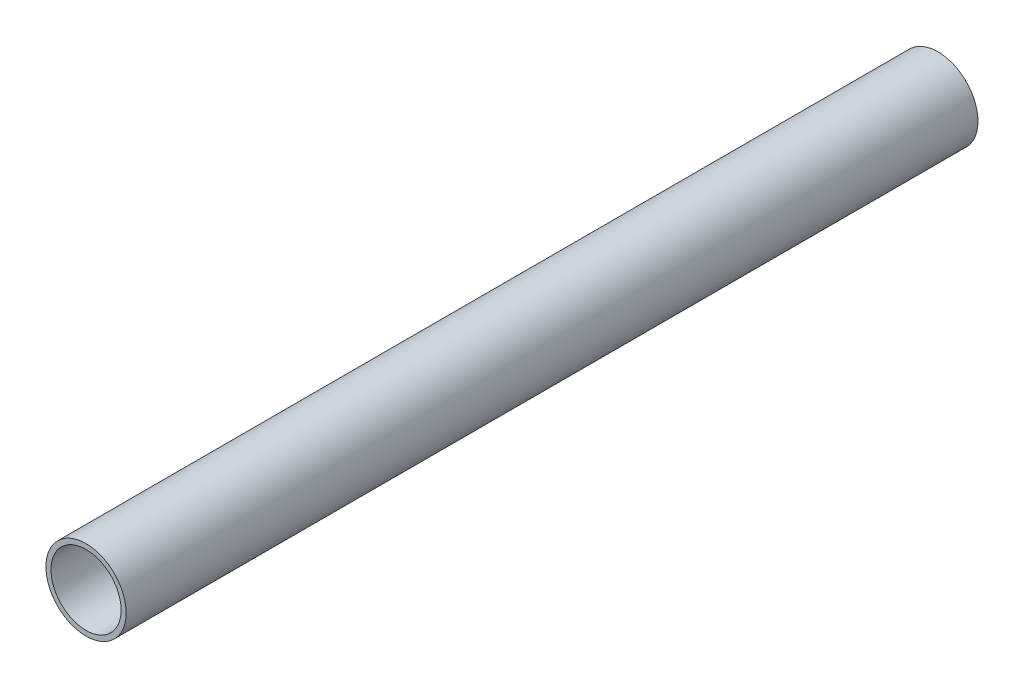
ISO-10303-21;
HEADER;
FILE_DESCRIPTION(('STEP AP214'),'2;1');
FILE_NAME('part.step','',(''),(''),'','','');
FILE_SCHEMA(('AUTOMOTIVE_DESIGN { 1 0 10303 214 1 1 1 1 }'));
ENDSEC;
DATA;
#1=APPLICATION_CONTEXT('core data for automotive mechanical design processes');
#2=APPLICATION_PROTOCOL_DEFINITION('international standard','automotive_design',2000,#1);
#3=PRODUCT_CONTEXT('',#1,'mechanical');
#4=PRODUCT('Part','Part','',(#3));
#5=PRODUCT_RELATED_PRODUCT_CATEGORY('part','',(#4));
#6=PRODUCT_DEFINITION_FORMATION('','',#4);
#7=PRODUCT_DEFINITION_CONTEXT('part definition',#1,'design');
#8=PRODUCT_DEFINITION('design','',#6,#7);
#9=PRODUCT_DEFINITION_SHAPE('','',#8);
#10=(LENGTH_UNIT() NAMED_UNIT(*) SI_UNIT(.MILLI.,.METRE.));
#11=(NAMED_UNIT(*) PLANE_ANGLE_UNIT() SI_UNIT($,.RADIAN.));
#12=(NAMED_UNIT(*) SI_UNIT($,.STERADIAN.) SOLID_ANGLE_UNIT());
#13=UNCERTAINTY_MEASURE_WITH_UNIT(LENGTH_MEASURE(1.E-05),#10,'distance_accuracy_value','');
#14=(GEOMETRIC_REPRESENTATION_CONTEXT(3) GLOBAL_UNCERTAINTY_ASSIGNED_CONTEXT((#13)) GLOBAL_UNIT_ASSIGNED_CONTEXT((#10,
#11,#12)) REPRESENTATION_CONTEXT('',''));
#15=CARTESIAN_POINT('',(0.,0.,0.));
#16=DIRECTION('',(0.,0.,1.));
#17=DIRECTION('',(1.,0.,0.));
#18=AXIS2_PLACEMENT_3D('',#15,#16,#17);
#19=CARTESIAN_POINT('',(0.,0.,269.89405));
#20=DIRECTION('',(0.,0.,1.));
#21=DIRECTION('',(1.,0.,0.));
#22=AXIS2_PLACEMENT_3D('',#19,#20,#21);
#23=PLANE('',#22);
#24=CARTESIAN_POINT('',(0.,0.,269.89405));
#25=DIRECTION('',(0.,0.,1.));
#26=DIRECTION('',(1.,0.,0.));
#27=AXIS2_PLACEMENT_3D('',#24,#25,#26);
#28=CIRCLE('',#27,25.4);
#29=CARTESIAN_POINT('',(25.4,0.,269.89405));
#30=VERTEX_POINT('',#29);
#31=EDGE_CURVE('E10',#30,#30,#28,.T.);
#32=ORIENTED_EDGE('',*,*,#31,.T.);
#33=EDGE_LOOP('',(#32));
#34=FACE_BOUND('',#33,.T.);
#35=CARTESIAN_POINT('',(0.,0.,269.89405));
#36=DIRECTION('',(0.,0.,1.));
#37=DIRECTION('',(1.,0.,0.));
#38=AXIS2_PLACEMENT_3D('',#35,#36,#37);
#39=CIRCLE('',#38,22.225);
#40=CARTESIAN_POINT('',(22.225,0.,269.89405));
#41=VERTEX_POINT('',#40);
#42=EDGE_CURVE('E54',#41,#41,#39,.T.);
#43=ORIENTED_EDGE('',*,*,#42,.F.);
#44=EDGE_LOOP('',(#43));
#45=FACE_BOUND('',#44,.T.);
#46=ADVANCED_FACE('F41',(#34,#45),#23,.T.);
#47=CARTESIAN_POINT('',(0.,0.,-269.89405));
#48=DIRECTION('',(0.,0.,1.));
#49=DIRECTION('',(1.,0.,0.));
#50=AXIS2_PLACEMENT_3D('',#47,#48,#49);
#51=PLANE('',#50);
#52=CARTESIAN_POINT('',(0.,0.,-269.89405));
#53=DIRECTION('',(0.,0.,1.));
#54=DIRECTION('',(1.,0.,0.));
#55=AXIS2_PLACEMENT_3D('',#52,#53,#54);
#56=CIRCLE('',#55,25.4);
#57=CARTESIAN_POINT('',(25.4,0.,-269.89405));
#58=VERTEX_POINT('',#57);
#59=EDGE_CURVE('E45',#58,#58,#56,.T.);
#60=ORIENTED_EDGE('',*,*,#59,.F.);
#61=EDGE_LOOP('',(#60));
#62=FACE_BOUND('',#61,.T.);
#63=CARTESIAN_POINT('',(0.,0.,-269.89405));
#64=DIRECTION('',(0.,0.,1.));
#65=DIRECTION('',(1.,0.,0.));
#66=AXIS2_PLACEMENT_3D('',#63,#64,#65);
#67=CIRCLE('',#66,22.225);
#68=CARTESIAN_POINT('',(22.225,0.,-269.89405));
#69=VERTEX_POINT('',#68);
#70=EDGE_CURVE('E56',#69,#69,#67,.T.);
#71=ORIENTED_EDGE('',*,*,#70,.T.);
#72=EDGE_LOOP('',(#71));
#73=FACE_BOUND('',#72,.T.);
#74=ADVANCED_FACE('F68',(#62,#73),#51,.F.);
#75=CARTESIAN_POINT('',(0.,0.,269.89405));
#76=DIRECTION('',(0.,0.,-1.));
#77=DIRECTION('',(-1.,0.,0.));
#78=AXIS2_PLACEMENT_3D('',#75,#76,#77);
#79=CYLINDRICAL_SURFACE('',#78,25.4);
#80=ORIENTED_EDGE('',*,*,#31,.F.);
#81=EDGE_LOOP('',(#80));
#82=FACE_BOUND('',#81,.T.);
#83=ORIENTED_EDGE('',*,*,#59,.T.);
#84=EDGE_LOOP('',(#83));
#85=FACE_BOUND('',#84,.T.);
#86=ADVANCED_FACE('F43',(#82,#85),#79,.T.);
#87=CARTESIAN_POINT('',(0.,0.,269.89405));
#88=DIRECTION('',(0.,0.,-1.));
#89=DIRECTION('',(-1.,0.,0.));
#90=AXIS2_PLACEMENT_3D('',#87,#88,#89);
#91=CYLINDRICAL_SURFACE('',#90,22.225);
#92=ORIENTED_EDGE('',*,*,#42,.T.);
#93=EDGE_LOOP('',(#92));
#94=FACE_BOUND('',#93,.T.);
#95=ORIENTED_EDGE('',*,*,#70,.F.);
#96=EDGE_LOOP('',(#95));
#97=FACE_BOUND('',#96,.T.);
#98=ADVANCED_FACE('F64',(#94,#97),#91,.F.);
#99=CLOSED_SHELL('',(#46,#74,#86,#98));
#100=MANIFOLD_SOLID_BREP('B2',#99);
#101=ADVANCED_BREP_SHAPE_REPRESENTATION('',(#18,#100),#14);
#102=SHAPE_DEFINITION_REPRESENTATION(#9,#101);
ENDSEC;
END-ISO-10303-21;
